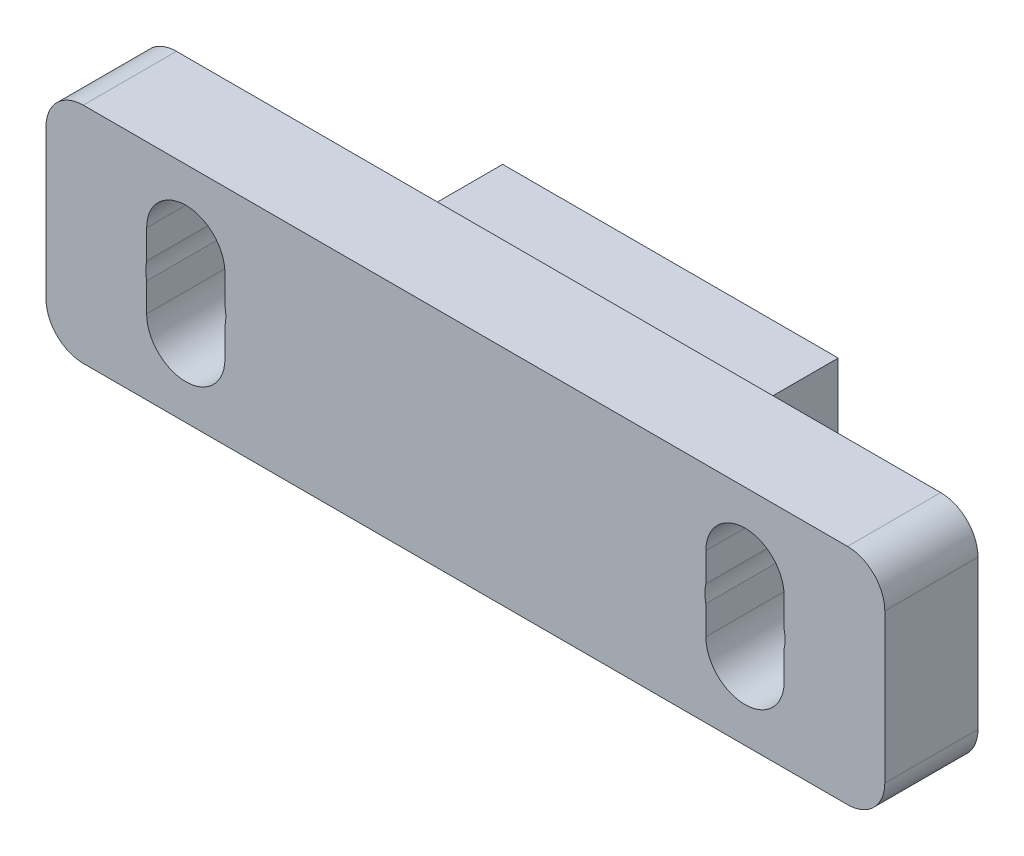
ISO-10303-21;
HEADER;
FILE_DESCRIPTION(('STEP AP214'),'2;1');
FILE_NAME('part.step','',(''),(''),'','','');
FILE_SCHEMA(('AUTOMOTIVE_DESIGN { 1 0 10303 214 1 1 1 1 }'));
ENDSEC;
DATA;
#1=APPLICATION_CONTEXT('core data for automotive mechanical design processes');
#2=APPLICATION_PROTOCOL_DEFINITION('international standard','automotive_design',2000,#1);
#3=PRODUCT_CONTEXT('',#1,'mechanical');
#4=PRODUCT('Part','Part','',(#3));
#5=PRODUCT_RELATED_PRODUCT_CATEGORY('part','',(#4));
#6=PRODUCT_DEFINITION_FORMATION('','',#4);
#7=PRODUCT_DEFINITION_CONTEXT('part definition',#1,'design');
#8=PRODUCT_DEFINITION('design','',#6,#7);
#9=PRODUCT_DEFINITION_SHAPE('','',#8);
#10=(LENGTH_UNIT() NAMED_UNIT(*) SI_UNIT(.MILLI.,.METRE.));
#11=(NAMED_UNIT(*) PLANE_ANGLE_UNIT() SI_UNIT($,.RADIAN.));
#12=(NAMED_UNIT(*) SI_UNIT($,.STERADIAN.) SOLID_ANGLE_UNIT());
#13=UNCERTAINTY_MEASURE_WITH_UNIT(LENGTH_MEASURE(1.E-05),#10,'distance_accuracy_value','');
#14=(GEOMETRIC_REPRESENTATION_CONTEXT(3) GLOBAL_UNCERTAINTY_ASSIGNED_CONTEXT((#13)) GLOBAL_UNIT_ASSIGNED_CONTEXT((#10,
#11,#12)) REPRESENTATION_CONTEXT('',''));
#15=CARTESIAN_POINT('',(0.,0.,0.));
#16=DIRECTION('',(0.,0.,1.));
#17=DIRECTION('',(1.,0.,0.));
#18=AXIS2_PLACEMENT_3D('',#15,#16,#17);
#19=CARTESIAN_POINT('',(15.,0.,5.));
#20=DIRECTION('',(0.,0.,-1.));
#21=DIRECTION('',(-1.,0.,0.));
#22=AXIS2_PLACEMENT_3D('',#19,#20,#21);
#23=CYLINDRICAL_SURFACE('',#22,2.15);
#24=DIRECTION('',(0.,0.,-1.));
#25=VECTOR('',#24,1.);
#26=CARTESIAN_POINT('',(12.9,0.460977222864625,5.));
#27=LINE('',#26,#25);
#28=CARTESIAN_POINT('',(12.9,0.460977222864625,5.));
#29=VERTEX_POINT('',#28);
#30=CARTESIAN_POINT('',(12.9,0.460977222864625,0.));
#31=VERTEX_POINT('',#30);
#32=EDGE_CURVE('E263',#29,#31,#27,.T.);
#33=ORIENTED_EDGE('',*,*,#32,.F.);
#34=CARTESIAN_POINT('',(15.,0.,5.));
#35=DIRECTION('',(0.,0.,1.));
#36=DIRECTION('',(1.,0.,0.));
#37=AXIS2_PLACEMENT_3D('',#34,#35,#36);
#38=CIRCLE('',#37,2.15);
#39=CARTESIAN_POINT('',(12.9,-0.460977222864632,5.));
#40=VERTEX_POINT('',#39);
#41=EDGE_CURVE('E380',#29,#40,#38,.T.);
#42=ORIENTED_EDGE('',*,*,#41,.T.);
#43=DIRECTION('',(0.,0.,-1.));
#44=VECTOR('',#43,1.);
#45=CARTESIAN_POINT('',(12.9,-0.460977222864632,5.));
#46=LINE('',#45,#44);
#47=CARTESIAN_POINT('',(12.9,-0.460977222864632,0.));
#48=VERTEX_POINT('',#47);
#49=EDGE_CURVE('E418',#48,#40,#46,.F.);
#50=ORIENTED_EDGE('',*,*,#49,.F.);
#51=CARTESIAN_POINT('',(15.,0.,0.));
#52=DIRECTION('',(0.,0.,1.));
#53=DIRECTION('',(1.,0.,0.));
#54=AXIS2_PLACEMENT_3D('',#51,#52,#53);
#55=CIRCLE('',#54,2.15);
#56=EDGE_CURVE('E381',#31,#48,#55,.T.);
#57=ORIENTED_EDGE('',*,*,#56,.F.);
#58=EDGE_LOOP('',(#33,#42,#50,#57));
#59=FACE_BOUND('',#58,.T.);
#60=ADVANCED_FACE('F32',(#59),#23,.F.);
#61=CARTESIAN_POINT('',(-15.,0.,5.));
#62=DIRECTION('',(0.,0.,-1.));
#63=DIRECTION('',(-1.,0.,0.));
#64=AXIS2_PLACEMENT_3D('',#61,#62,#63);
#65=CYLINDRICAL_SURFACE('',#64,2.15);
#66=DIRECTION('',(0.,0.,-1.));
#67=VECTOR('',#66,1.);
#68=CARTESIAN_POINT('',(-12.9,-0.46097722286464,5.));
#69=LINE('',#68,#67);
#70=CARTESIAN_POINT('',(-12.9,-0.460977222864644,5.));
#71=VERTEX_POINT('',#70);
#72=CARTESIAN_POINT('',(-12.9,-0.460977222864644,0.));
#73=VERTEX_POINT('',#72);
#74=EDGE_CURVE('E413',#71,#73,#69,.T.);
#75=ORIENTED_EDGE('',*,*,#74,.F.);
#76=CARTESIAN_POINT('',(-15.,0.,5.));
#77=DIRECTION('',(0.,0.,1.));
#78=DIRECTION('',(1.,0.,0.));
#79=AXIS2_PLACEMENT_3D('',#76,#77,#78);
#80=CIRCLE('',#79,2.15);
#81=CARTESIAN_POINT('',(-12.9,0.460977222864639,5.));
#82=VERTEX_POINT('',#81);
#83=EDGE_CURVE('E384',#71,#82,#80,.T.);
#84=ORIENTED_EDGE('',*,*,#83,.T.);
#85=DIRECTION('',(0.,0.,-1.));
#86=VECTOR('',#85,1.);
#87=CARTESIAN_POINT('',(-12.9,0.460977222864634,5.));
#88=LINE('',#87,#86);
#89=CARTESIAN_POINT('',(-12.9,0.460977222864639,0.));
#90=VERTEX_POINT('',#89);
#91=EDGE_CURVE('E409',#90,#82,#88,.F.);
#92=ORIENTED_EDGE('',*,*,#91,.F.);
#93=CARTESIAN_POINT('',(-15.,0.,0.));
#94=DIRECTION('',(0.,0.,1.));
#95=DIRECTION('',(1.,0.,0.));
#96=AXIS2_PLACEMENT_3D('',#93,#94,#95);
#97=CIRCLE('',#96,2.15);
#98=EDGE_CURVE('E389',#73,#90,#97,.T.);
#99=ORIENTED_EDGE('',*,*,#98,.F.);
#100=EDGE_LOOP('',(#75,#84,#92,#99));
#101=FACE_BOUND('',#100,.T.);
#102=ADVANCED_FACE('F468',(#101),#65,.F.);
#103=CARTESIAN_POINT('',(0.,0.,5.));
#104=DIRECTION('',(0.,0.,1.));
#105=DIRECTION('',(1.,0.,0.));
#106=AXIS2_PLACEMENT_3D('',#103,#104,#105);
#107=PLANE('',#106);
#108=DIRECTION('',(0.,-1.,0.));
#109=VECTOR('',#108,1.);
#110=CARTESIAN_POINT('',(12.9,-2.,5.));
#111=LINE('',#110,#109);
#112=CARTESIAN_POINT('',(12.9,-2.,5.));
#113=VERTEX_POINT('',#112);
#114=EDGE_CURVE('E329',#40,#113,#111,.T.);
#115=ORIENTED_EDGE('',*,*,#114,.F.);
#116=ORIENTED_EDGE('',*,*,#41,.F.);
#117=CARTESIAN_POINT('',(12.9,2.,5.));
#118=VERTEX_POINT('',#117);
#119=EDGE_CURVE('E312',#118,#29,#111,.T.);
#120=ORIENTED_EDGE('',*,*,#119,.F.);
#121=CARTESIAN_POINT('',(15.,2.,5.));
#122=DIRECTION('',(0.,0.,1.));
#123=DIRECTION('',(1.,0.,0.));
#124=AXIS2_PLACEMENT_3D('',#121,#122,#123);
#125=CIRCLE('',#124,2.1);
#126=CARTESIAN_POINT('',(17.1,2.,5.));
#127=VERTEX_POINT('',#126);
#128=EDGE_CURVE('E326',#127,#118,#125,.T.);
#129=ORIENTED_EDGE('',*,*,#128,.F.);
#130=DIRECTION('',(0.,1.,0.));
#131=VECTOR('',#130,1.);
#132=CARTESIAN_POINT('',(17.1,-2.,5.));
#133=LINE('',#132,#131);
#134=CARTESIAN_POINT('',(17.1,0.460977222864625,5.));
#135=VERTEX_POINT('',#134);
#136=EDGE_CURVE('E305',#135,#127,#133,.T.);
#137=ORIENTED_EDGE('',*,*,#136,.F.);
#138=CARTESIAN_POINT('',(17.1,-0.460977222864632,5.));
#139=VERTEX_POINT('',#138);
#140=EDGE_CURVE('E377',#139,#135,#38,.T.);
#141=ORIENTED_EDGE('',*,*,#140,.F.);
#142=CARTESIAN_POINT('',(17.1,-2.,5.));
#143=VERTEX_POINT('',#142);
#144=EDGE_CURVE('E324',#143,#139,#133,.T.);
#145=ORIENTED_EDGE('',*,*,#144,.F.);
#146=CARTESIAN_POINT('',(15.,-2.,5.));
#147=DIRECTION('',(0.,0.,1.));
#148=DIRECTION('',(1.,0.,0.));
#149=AXIS2_PLACEMENT_3D('',#146,#147,#148);
#150=CIRCLE('',#149,2.1);
#151=EDGE_CURVE('E303',#113,#143,#150,.T.);
#152=ORIENTED_EDGE('',*,*,#151,.F.);
#153=EDGE_LOOP('',(#115,#116,#120,#129,#137,#141,#145,#152));
#154=FACE_BOUND('',#153,.T.);
#155=DIRECTION('',(0.,1.,0.));
#156=VECTOR('',#155,1.);
#157=CARTESIAN_POINT('',(-12.9,2.,5.));
#158=LINE('',#157,#156);
#159=CARTESIAN_POINT('',(-12.9,2.,5.));
#160=VERTEX_POINT('',#159);
#161=EDGE_CURVE('E365',#82,#160,#158,.T.);
#162=ORIENTED_EDGE('',*,*,#161,.F.);
#163=ORIENTED_EDGE('',*,*,#83,.F.);
#164=CARTESIAN_POINT('',(-12.9,-2.,5.));
#165=VERTEX_POINT('',#164);
#166=EDGE_CURVE('E345',#165,#71,#158,.T.);
#167=ORIENTED_EDGE('',*,*,#166,.F.);
#168=CARTESIAN_POINT('',(-15.,-2.,5.));
#169=DIRECTION('',(0.,0.,1.));
#170=DIRECTION('',(1.,0.,0.));
#171=AXIS2_PLACEMENT_3D('',#168,#169,#170);
#172=CIRCLE('',#171,2.1);
#173=CARTESIAN_POINT('',(-17.1,-2.,5.));
#174=VERTEX_POINT('',#173);
#175=EDGE_CURVE('E362',#174,#165,#172,.T.);
#176=ORIENTED_EDGE('',*,*,#175,.F.);
#177=DIRECTION('',(0.,-1.,0.));
#178=VECTOR('',#177,1.);
#179=CARTESIAN_POINT('',(-17.1,2.,5.));
#180=LINE('',#179,#178);
#181=CARTESIAN_POINT('',(-17.1,-0.460977222864641,5.));
#182=VERTEX_POINT('',#181);
#183=EDGE_CURVE('E359',#182,#174,#180,.T.);
#184=ORIENTED_EDGE('',*,*,#183,.F.);
#185=CARTESIAN_POINT('',(-17.1,0.460977222864633,5.));
#186=VERTEX_POINT('',#185);
#187=EDGE_CURVE('E387',#186,#182,#80,.T.);
#188=ORIENTED_EDGE('',*,*,#187,.F.);
#189=CARTESIAN_POINT('',(-17.1,2.,5.));
#190=VERTEX_POINT('',#189);
#191=EDGE_CURVE('E360',#190,#186,#180,.T.);
#192=ORIENTED_EDGE('',*,*,#191,.F.);
#193=CARTESIAN_POINT('',(-15.,2.,5.));
#194=DIRECTION('',(0.,0.,1.));
#195=DIRECTION('',(1.,0.,0.));
#196=AXIS2_PLACEMENT_3D('',#193,#194,#195);
#197=CIRCLE('',#196,2.1);
#198=EDGE_CURVE('E334',#160,#190,#197,.T.);
#199=ORIENTED_EDGE('',*,*,#198,.F.);
#200=EDGE_LOOP('',(#162,#163,#167,#176,#184,#188,#192,#199));
#201=FACE_BOUND('',#200,.T.);
#202=DIRECTION('',(-1.,0.,0.));
#203=VECTOR('',#202,1.);
#204=CARTESIAN_POINT('',(-22.5,6.,5.));
#205=LINE('',#204,#203);
#206=CARTESIAN_POINT('',(20.5,6.,5.));
#207=VERTEX_POINT('',#206);
#208=CARTESIAN_POINT('',(-20.5,6.,5.));
#209=VERTEX_POINT('',#208);
#210=EDGE_CURVE('E399',#207,#209,#205,.T.);
#211=ORIENTED_EDGE('',*,*,#210,.T.);
#212=CARTESIAN_POINT('',(-20.5,4.,5.));
#213=DIRECTION('',(0.,0.,1.));
#214=DIRECTION('',(1.,0.,0.));
#215=AXIS2_PLACEMENT_3D('',#212,#213,#214);
#216=CIRCLE('',#215,2.);
#217=CARTESIAN_POINT('',(-22.5,4.,5.));
#218=VERTEX_POINT('',#217);
#219=EDGE_CURVE('E530',#209,#218,#216,.T.);
#220=ORIENTED_EDGE('',*,*,#219,.T.);
#221=DIRECTION('',(0.,-1.,0.));
#222=VECTOR('',#221,1.);
#223=CARTESIAN_POINT('',(-22.5,6.,5.));
#224=LINE('',#223,#222);
#225=CARTESIAN_POINT('',(-22.5,-4.,5.));
#226=VERTEX_POINT('',#225);
#227=EDGE_CURVE('E392',#218,#226,#224,.T.);
#228=ORIENTED_EDGE('',*,*,#227,.T.);
#229=CARTESIAN_POINT('',(-20.5,-4.,5.));
#230=DIRECTION('',(0.,0.,1.));
#231=DIRECTION('',(1.,0.,0.));
#232=AXIS2_PLACEMENT_3D('',#229,#230,#231);
#233=CIRCLE('',#232,2.);
#234=CARTESIAN_POINT('',(-20.5,-6.,5.));
#235=VERTEX_POINT('',#234);
#236=EDGE_CURVE('E527',#226,#235,#233,.T.);
#237=ORIENTED_EDGE('',*,*,#236,.T.);
#238=DIRECTION('',(1.,0.,0.));
#239=VECTOR('',#238,1.);
#240=CARTESIAN_POINT('',(-22.5,-6.,5.));
#241=LINE('',#240,#239);
#242=CARTESIAN_POINT('',(20.5,-6.,5.));
#243=VERTEX_POINT('',#242);
#244=EDGE_CURVE('E395',#235,#243,#241,.T.);
#245=ORIENTED_EDGE('',*,*,#244,.T.);
#246=CARTESIAN_POINT('',(20.5,-4.,5.));
#247=DIRECTION('',(0.,0.,1.));
#248=DIRECTION('',(1.,0.,0.));
#249=AXIS2_PLACEMENT_3D('',#246,#247,#248);
#250=CIRCLE('',#249,2.);
#251=CARTESIAN_POINT('',(22.5,-4.,5.));
#252=VERTEX_POINT('',#251);
#253=EDGE_CURVE('E53',#243,#252,#250,.T.);
#254=ORIENTED_EDGE('',*,*,#253,.T.);
#255=DIRECTION('',(0.,1.,0.));
#256=VECTOR('',#255,1.);
#257=CARTESIAN_POINT('',(22.5,6.,5.));
#258=LINE('',#257,#256);
#259=CARTESIAN_POINT('',(22.5,4.,5.));
#260=VERTEX_POINT('',#259);
#261=EDGE_CURVE('E398',#252,#260,#258,.T.);
#262=ORIENTED_EDGE('',*,*,#261,.T.);
#263=CARTESIAN_POINT('',(20.5,4.,5.));
#264=DIRECTION('',(0.,0.,1.));
#265=DIRECTION('',(1.,0.,0.));
#266=AXIS2_PLACEMENT_3D('',#263,#264,#265);
#267=CIRCLE('',#266,2.);
#268=EDGE_CURVE('E528',#260,#207,#267,.T.);
#269=ORIENTED_EDGE('',*,*,#268,.T.);
#270=EDGE_LOOP('',(#211,#220,#228,#237,#245,#254,#262,#269));
#271=FACE_BOUND('',#270,.T.);
#272=ADVANCED_FACE('F436',(#154,#201,#271),#107,.T.);
#273=CARTESIAN_POINT('',(0.,0.,0.));
#274=DIRECTION('',(0.,0.,1.));
#275=DIRECTION('',(1.,0.,0.));
#276=AXIS2_PLACEMENT_3D('',#273,#274,#275);
#277=PLANE('',#276);
#278=ORIENTED_EDGE('',*,*,#98,.T.);
#279=DIRECTION('',(0.,1.,0.));
#280=VECTOR('',#279,1.);
#281=CARTESIAN_POINT('',(-12.9,2.,0.));
#282=LINE('',#281,#280);
#283=CARTESIAN_POINT('',(-12.9,2.,0.));
#284=VERTEX_POINT('',#283);
#285=EDGE_CURVE('E352',#90,#284,#282,.T.);
#286=ORIENTED_EDGE('',*,*,#285,.T.);
#287=CARTESIAN_POINT('',(-15.,2.,0.));
#288=DIRECTION('',(0.,0.,1.));
#289=DIRECTION('',(1.,0.,0.));
#290=AXIS2_PLACEMENT_3D('',#287,#288,#289);
#291=CIRCLE('',#290,2.1);
#292=CARTESIAN_POINT('',(-17.1,2.,0.));
#293=VERTEX_POINT('',#292);
#294=EDGE_CURVE('E341',#284,#293,#291,.T.);
#295=ORIENTED_EDGE('',*,*,#294,.T.);
#296=DIRECTION('',(0.,-1.,0.));
#297=VECTOR('',#296,1.);
#298=CARTESIAN_POINT('',(-17.1,2.,0.));
#299=LINE('',#298,#297);
#300=CARTESIAN_POINT('',(-17.1,0.460977222864633,0.));
#301=VERTEX_POINT('',#300);
#302=EDGE_CURVE('E346',#293,#301,#299,.T.);
#303=ORIENTED_EDGE('',*,*,#302,.T.);
#304=CARTESIAN_POINT('',(-17.1,-0.460977222864641,0.));
#305=VERTEX_POINT('',#304);
#306=EDGE_CURVE('E388',#301,#305,#97,.T.);
#307=ORIENTED_EDGE('',*,*,#306,.T.);
#308=CARTESIAN_POINT('',(-17.1,-2.,0.));
#309=VERTEX_POINT('',#308);
#310=EDGE_CURVE('E344',#305,#309,#299,.T.);
#311=ORIENTED_EDGE('',*,*,#310,.T.);
#312=CARTESIAN_POINT('',(-15.,-2.,0.));
#313=DIRECTION('',(0.,0.,1.));
#314=DIRECTION('',(1.,0.,0.));
#315=AXIS2_PLACEMENT_3D('',#312,#313,#314);
#316=CIRCLE('',#315,2.1);
#317=CARTESIAN_POINT('',(-12.9,-2.,0.));
#318=VERTEX_POINT('',#317);
#319=EDGE_CURVE('E349',#309,#318,#316,.T.);
#320=ORIENTED_EDGE('',*,*,#319,.T.);
#321=EDGE_CURVE('E353',#318,#73,#282,.T.);
#322=ORIENTED_EDGE('',*,*,#321,.T.);
#323=EDGE_LOOP('',(#278,#286,#295,#303,#307,#311,#320,#322));
#324=FACE_BOUND('',#323,.T.);
#325=DIRECTION('',(0.,-1.,0.));
#326=VECTOR('',#325,1.);
#327=CARTESIAN_POINT('',(-22.5,6.,0.));
#328=LINE('',#327,#326);
#329=CARTESIAN_POINT('',(-22.5,4.,0.));
#330=VERTEX_POINT('',#329);
#331=CARTESIAN_POINT('',(-22.5,-4.,0.));
#332=VERTEX_POINT('',#331);
#333=EDGE_CURVE('E275',#330,#332,#328,.T.);
#334=ORIENTED_EDGE('',*,*,#333,.F.);
#335=CARTESIAN_POINT('',(-20.5,4.,0.));
#336=DIRECTION('',(0.,0.,1.));
#337=DIRECTION('',(1.,0.,0.));
#338=AXIS2_PLACEMENT_3D('',#335,#336,#337);
#339=CIRCLE('',#338,2.);
#340=CARTESIAN_POINT('',(-20.5,6.,0.));
#341=VERTEX_POINT('',#340);
#342=EDGE_CURVE('E544',#330,#341,#339,.F.);
#343=ORIENTED_EDGE('',*,*,#342,.T.);
#344=DIRECTION('',(-1.,0.,0.));
#345=VECTOR('',#344,1.);
#346=CARTESIAN_POINT('',(-22.5,6.,0.));
#347=LINE('',#346,#345);
#348=CARTESIAN_POINT('',(20.5,6.,0.));
#349=VERTEX_POINT('',#348);
#350=EDGE_CURVE('E396',#349,#341,#347,.T.);
#351=ORIENTED_EDGE('',*,*,#350,.F.);
#352=CARTESIAN_POINT('',(20.5,4.,0.));
#353=DIRECTION('',(0.,0.,1.));
#354=DIRECTION('',(1.,0.,0.));
#355=AXIS2_PLACEMENT_3D('',#352,#353,#354);
#356=CIRCLE('',#355,2.);
#357=CARTESIAN_POINT('',(22.5,4.,0.));
#358=VERTEX_POINT('',#357);
#359=EDGE_CURVE('E266',#349,#358,#356,.F.);
#360=ORIENTED_EDGE('',*,*,#359,.T.);
#361=DIRECTION('',(0.,1.,0.));
#362=VECTOR('',#361,1.);
#363=CARTESIAN_POINT('',(22.5,6.,0.));
#364=LINE('',#363,#362);
#365=CARTESIAN_POINT('',(22.5,-4.,0.));
#366=VERTEX_POINT('',#365);
#367=EDGE_CURVE('E269',#366,#358,#364,.T.);
#368=ORIENTED_EDGE('',*,*,#367,.F.);
#369=CARTESIAN_POINT('',(20.5,-4.,0.));
#370=DIRECTION('',(0.,0.,1.));
#371=DIRECTION('',(1.,0.,0.));
#372=AXIS2_PLACEMENT_3D('',#369,#370,#371);
#373=CIRCLE('',#372,2.);
#374=CARTESIAN_POINT('',(20.5,-6.,0.));
#375=VERTEX_POINT('',#374);
#376=EDGE_CURVE('E545',#366,#375,#373,.F.);
#377=ORIENTED_EDGE('',*,*,#376,.T.);
#378=DIRECTION('',(1.,0.,0.));
#379=VECTOR('',#378,1.);
#380=CARTESIAN_POINT('',(-22.5,-6.,0.));
#381=LINE('',#380,#379);
#382=CARTESIAN_POINT('',(9.,-6.,0.));
#383=VERTEX_POINT('',#382);
#384=EDGE_CURVE('E270',#383,#375,#381,.T.);
#385=ORIENTED_EDGE('',*,*,#384,.F.);
#386=DIRECTION('',(0.,1.,0.));
#387=VECTOR('',#386,1.);
#388=CARTESIAN_POINT('',(9.,-6.,0.));
#389=LINE('',#388,#387);
#390=CARTESIAN_POINT('',(9.,3.5,0.));
#391=VERTEX_POINT('',#390);
#392=EDGE_CURVE('E248',#383,#391,#389,.T.);
#393=ORIENTED_EDGE('',*,*,#392,.T.);
#394=DIRECTION('',(-1.,0.,0.));
#395=VECTOR('',#394,1.);
#396=CARTESIAN_POINT('',(-9.,3.5,0.));
#397=LINE('',#396,#395);
#398=CARTESIAN_POINT('',(-9.,3.5,0.));
#399=VERTEX_POINT('',#398);
#400=EDGE_CURVE('E245',#391,#399,#397,.T.);
#401=ORIENTED_EDGE('',*,*,#400,.T.);
#402=DIRECTION('',(0.,-1.,0.));
#403=VECTOR('',#402,1.);
#404=CARTESIAN_POINT('',(-9.,-6.,0.));
#405=LINE('',#404,#403);
#406=CARTESIAN_POINT('',(-9.,-6.,0.));
#407=VERTEX_POINT('',#406);
#408=EDGE_CURVE('E256',#399,#407,#405,.T.);
#409=ORIENTED_EDGE('',*,*,#408,.T.);
#410=CARTESIAN_POINT('',(-20.5,-6.,0.));
#411=VERTEX_POINT('',#410);
#412=EDGE_CURVE('E225',#411,#407,#381,.T.);
#413=ORIENTED_EDGE('',*,*,#412,.F.);
#414=CARTESIAN_POINT('',(-20.5,-4.,0.));
#415=DIRECTION('',(0.,0.,1.));
#416=DIRECTION('',(1.,0.,0.));
#417=AXIS2_PLACEMENT_3D('',#414,#415,#416);
#418=CIRCLE('',#417,2.);
#419=EDGE_CURVE('E541',#411,#332,#418,.F.);
#420=ORIENTED_EDGE('',*,*,#419,.T.);
#421=EDGE_LOOP('',(#334,#343,#351,#360,#368,#377,#385,#393,#401,#409,#413,#420));
#422=FACE_BOUND('',#421,.T.);
#423=ORIENTED_EDGE('',*,*,#56,.T.);
#424=DIRECTION('',(0.,-1.,0.));
#425=VECTOR('',#424,1.);
#426=CARTESIAN_POINT('',(12.9,-2.,0.));
#427=LINE('',#426,#425);
#428=CARTESIAN_POINT('',(12.9,-2.,0.));
#429=VERTEX_POINT('',#428);
#430=EDGE_CURVE('E319',#48,#429,#427,.T.);
#431=ORIENTED_EDGE('',*,*,#430,.T.);
#432=CARTESIAN_POINT('',(15.,-2.,0.));
#433=DIRECTION('',(0.,0.,1.));
#434=DIRECTION('',(1.,0.,0.));
#435=AXIS2_PLACEMENT_3D('',#432,#433,#434);
#436=CIRCLE('',#435,2.1);
#437=CARTESIAN_POINT('',(17.1,-2.,0.));
#438=VERTEX_POINT('',#437);
#439=EDGE_CURVE('E308',#429,#438,#436,.T.);
#440=ORIENTED_EDGE('',*,*,#439,.T.);
#441=DIRECTION('',(0.,1.,0.));
#442=VECTOR('',#441,1.);
#443=CARTESIAN_POINT('',(17.1,-2.,0.));
#444=LINE('',#443,#442);
#445=CARTESIAN_POINT('',(17.1,-0.460977222864632,0.));
#446=VERTEX_POINT('',#445);
#447=EDGE_CURVE('E313',#438,#446,#444,.T.);
#448=ORIENTED_EDGE('',*,*,#447,.T.);
#449=CARTESIAN_POINT('',(17.1,0.460977222864625,0.));
#450=VERTEX_POINT('',#449);
#451=EDGE_CURVE('E370',#446,#450,#55,.T.);
#452=ORIENTED_EDGE('',*,*,#451,.T.);
#453=CARTESIAN_POINT('',(17.1,2.,0.));
#454=VERTEX_POINT('',#453);
#455=EDGE_CURVE('E311',#450,#454,#444,.T.);
#456=ORIENTED_EDGE('',*,*,#455,.T.);
#457=CARTESIAN_POINT('',(15.,2.,0.));
#458=DIRECTION('',(0.,0.,1.));
#459=DIRECTION('',(1.,0.,0.));
#460=AXIS2_PLACEMENT_3D('',#457,#458,#459);
#461=CIRCLE('',#460,2.1);
#462=CARTESIAN_POINT('',(12.9,2.,0.));
#463=VERTEX_POINT('',#462);
#464=EDGE_CURVE('E316',#454,#463,#461,.T.);
#465=ORIENTED_EDGE('',*,*,#464,.T.);
#466=EDGE_CURVE('E320',#463,#31,#427,.T.);
#467=ORIENTED_EDGE('',*,*,#466,.T.);
#468=EDGE_LOOP('',(#423,#431,#440,#448,#452,#456,#465,#467));
#469=FACE_BOUND('',#468,.T.);
#470=ADVANCED_FACE('F295',(#324,#422,#469),#277,.F.);
#471=CARTESIAN_POINT('',(-22.5,6.,5.));
#472=DIRECTION('',(1.,0.,0.));
#473=DIRECTION('',(0.,1.,0.));
#474=AXIS2_PLACEMENT_3D('',#471,#472,#473);
#475=PLANE('',#474);
#476=ORIENTED_EDGE('',*,*,#227,.F.);
#477=DIRECTION('',(0.,0.,-1.));
#478=VECTOR('',#477,1.);
#479=CARTESIAN_POINT('',(-22.5,4.,5.));
#480=LINE('',#479,#478);
#481=EDGE_CURVE('E262',#218,#330,#480,.T.);
#482=ORIENTED_EDGE('',*,*,#481,.T.);
#483=ORIENTED_EDGE('',*,*,#333,.T.);
#484=DIRECTION('',(0.,0.,-1.));
#485=VECTOR('',#484,1.);
#486=CARTESIAN_POINT('',(-22.5,-4.,5.));
#487=LINE('',#486,#485);
#488=EDGE_CURVE('E260',#332,#226,#487,.F.);
#489=ORIENTED_EDGE('',*,*,#488,.T.);
#490=EDGE_LOOP('',(#476,#482,#483,#489));
#491=FACE_BOUND('',#490,.T.);
#492=ADVANCED_FACE('F500',(#491),#475,.F.);
#493=CARTESIAN_POINT('',(-22.5,-6.,5.));
#494=DIRECTION('',(0.,1.,0.));
#495=DIRECTION('',(0.,0.,1.));
#496=AXIS2_PLACEMENT_3D('',#493,#494,#495);
#497=PLANE('',#496);
#498=ORIENTED_EDGE('',*,*,#244,.F.);
#499=DIRECTION('',(0.,0.,-1.));
#500=VECTOR('',#499,1.);
#501=CARTESIAN_POINT('',(-20.5,-6.,5.));
#502=LINE('',#501,#500);
#503=EDGE_CURVE('E538',#235,#411,#502,.T.);
#504=ORIENTED_EDGE('',*,*,#503,.T.);
#505=ORIENTED_EDGE('',*,*,#412,.T.);
#506=DIRECTION('',(0.,0.,1.));
#507=VECTOR('',#506,1.);
#508=CARTESIAN_POINT('',(-9.,-6.,-6.));
#509=LINE('',#508,#507);
#510=CARTESIAN_POINT('',(-9.,-6.,-6.));
#511=VERTEX_POINT('',#510);
#512=EDGE_CURVE('E218',#511,#407,#509,.T.);
#513=ORIENTED_EDGE('',*,*,#512,.F.);
#514=DIRECTION('',(1.,0.,0.));
#515=VECTOR('',#514,1.);
#516=CARTESIAN_POINT('',(-9.,-6.,-6.));
#517=LINE('',#516,#515);
#518=CARTESIAN_POINT('',(9.,-6.,-6.));
#519=VERTEX_POINT('',#518);
#520=EDGE_CURVE('E222',#511,#519,#517,.T.);
#521=ORIENTED_EDGE('',*,*,#520,.T.);
#522=DIRECTION('',(0.,0.,1.));
#523=VECTOR('',#522,1.);
#524=CARTESIAN_POINT('',(9.,-6.,-6.));
#525=LINE('',#524,#523);
#526=EDGE_CURVE('E229',#519,#383,#525,.T.);
#527=ORIENTED_EDGE('',*,*,#526,.T.);
#528=ORIENTED_EDGE('',*,*,#384,.T.);
#529=DIRECTION('',(0.,0.,-1.));
#530=VECTOR('',#529,1.);
#531=CARTESIAN_POINT('',(20.5,-6.,5.));
#532=LINE('',#531,#530);
#533=EDGE_CURVE('E526',#375,#243,#532,.F.);
#534=ORIENTED_EDGE('',*,*,#533,.T.);
#535=EDGE_LOOP('',(#498,#504,#505,#513,#521,#527,#528,#534));
#536=FACE_BOUND('',#535,.T.);
#537=ADVANCED_FACE('F221',(#536),#497,.F.);
#538=CARTESIAN_POINT('',(22.5,6.,5.));
#539=DIRECTION('',(-1.,0.,0.));
#540=DIRECTION('',(0.,-1.,0.));
#541=AXIS2_PLACEMENT_3D('',#538,#539,#540);
#542=PLANE('',#541);
#543=ORIENTED_EDGE('',*,*,#261,.F.);
#544=DIRECTION('',(0.,0.,-1.));
#545=VECTOR('',#544,1.);
#546=CARTESIAN_POINT('',(22.5,-4.,5.));
#547=LINE('',#546,#545);
#548=EDGE_CURVE('E11',#252,#366,#547,.T.);
#549=ORIENTED_EDGE('',*,*,#548,.T.);
#550=ORIENTED_EDGE('',*,*,#367,.T.);
#551=DIRECTION('',(0.,0.,-1.));
#552=VECTOR('',#551,1.);
#553=CARTESIAN_POINT('',(22.5,4.,5.));
#554=LINE('',#553,#552);
#555=EDGE_CURVE('E40',#358,#260,#554,.F.);
#556=ORIENTED_EDGE('',*,*,#555,.T.);
#557=EDGE_LOOP('',(#543,#549,#550,#556));
#558=FACE_BOUND('',#557,.T.);
#559=ADVANCED_FACE('F492',(#558),#542,.F.);
#560=CARTESIAN_POINT('',(-22.5,6.,5.));
#561=DIRECTION('',(0.,-1.,0.));
#562=DIRECTION('',(1.,0.,0.));
#563=AXIS2_PLACEMENT_3D('',#560,#561,#562);
#564=PLANE('',#563);
#565=ORIENTED_EDGE('',*,*,#350,.T.);
#566=DIRECTION('',(0.,0.,-1.));
#567=VECTOR('',#566,1.);
#568=CARTESIAN_POINT('',(-20.5,6.,5.));
#569=LINE('',#568,#567);
#570=EDGE_CURVE('E532',#341,#209,#569,.F.);
#571=ORIENTED_EDGE('',*,*,#570,.T.);
#572=ORIENTED_EDGE('',*,*,#210,.F.);
#573=DIRECTION('',(0.,0.,-1.));
#574=VECTOR('',#573,1.);
#575=CARTESIAN_POINT('',(20.5,6.,5.));
#576=LINE('',#575,#574);
#577=EDGE_CURVE('E552',#207,#349,#576,.T.);
#578=ORIENTED_EDGE('',*,*,#577,.T.);
#579=EDGE_LOOP('',(#565,#571,#572,#578));
#580=FACE_BOUND('',#579,.T.);
#581=ADVANCED_FACE('F487',(#580),#564,.F.);
#582=DIRECTION('',(0.,0.,-1.));
#583=VECTOR('',#582,1.);
#584=CARTESIAN_POINT('',(-17.1,0.460977222864633,5.));
#585=LINE('',#584,#583);
#586=EDGE_CURVE('E404',#186,#301,#585,.T.);
#587=ORIENTED_EDGE('',*,*,#586,.F.);
#588=ORIENTED_EDGE('',*,*,#187,.T.);
#589=DIRECTION('',(0.,0.,-1.));
#590=VECTOR('',#589,1.);
#591=CARTESIAN_POINT('',(-17.1,-0.460977222864641,5.));
#592=LINE('',#591,#590);
#593=EDGE_CURVE('E401',#305,#182,#592,.F.);
#594=ORIENTED_EDGE('',*,*,#593,.F.);
#595=ORIENTED_EDGE('',*,*,#306,.F.);
#596=EDGE_LOOP('',(#587,#588,#594,#595));
#597=FACE_BOUND('',#596,.T.);
#598=ADVANCED_FACE('F475',(#597),#65,.F.);
#599=DIRECTION('',(0.,0.,-1.));
#600=VECTOR('',#599,1.);
#601=CARTESIAN_POINT('',(17.1,-0.460977222864632,5.));
#602=LINE('',#601,#600);
#603=EDGE_CURVE('E417',#139,#446,#602,.T.);
#604=ORIENTED_EDGE('',*,*,#603,.F.);
#605=ORIENTED_EDGE('',*,*,#140,.T.);
#606=DIRECTION('',(0.,0.,-1.));
#607=VECTOR('',#606,1.);
#608=CARTESIAN_POINT('',(17.1,0.460977222864625,5.));
#609=LINE('',#608,#607);
#610=EDGE_CURVE('E415',#450,#135,#609,.F.);
#611=ORIENTED_EDGE('',*,*,#610,.F.);
#612=ORIENTED_EDGE('',*,*,#451,.F.);
#613=EDGE_LOOP('',(#604,#605,#611,#612));
#614=FACE_BOUND('',#613,.T.);
#615=ADVANCED_FACE('F451',(#614),#23,.F.);
#616=CARTESIAN_POINT('',(-12.9,2.,0.));
#617=DIRECTION('',(1.,0.,0.));
#618=DIRECTION('',(0.,1.,0.));
#619=AXIS2_PLACEMENT_3D('',#616,#617,#618);
#620=PLANE('',#619);
#621=ORIENTED_EDGE('',*,*,#74,.T.);
#622=ORIENTED_EDGE('',*,*,#321,.F.);
#623=DIRECTION('',(0.,0.,1.));
#624=VECTOR('',#623,1.);
#625=CARTESIAN_POINT('',(-12.9,-2.,0.));
#626=LINE('',#625,#624);
#627=EDGE_CURVE('E371',#318,#165,#626,.T.);
#628=ORIENTED_EDGE('',*,*,#627,.T.);
#629=ORIENTED_EDGE('',*,*,#166,.T.);
#630=EDGE_LOOP('',(#621,#622,#628,#629));
#631=FACE_BOUND('',#630,.T.);
#632=ADVANCED_FACE('F478',(#631),#620,.F.);
#633=CARTESIAN_POINT('',(-17.1,2.,0.));
#634=DIRECTION('',(-1.,0.,0.));
#635=DIRECTION('',(0.,0.,1.));
#636=AXIS2_PLACEMENT_3D('',#633,#634,#635);
#637=PLANE('',#636);
#638=ORIENTED_EDGE('',*,*,#593,.T.);
#639=ORIENTED_EDGE('',*,*,#183,.T.);
#640=DIRECTION('',(0.,0.,1.));
#641=VECTOR('',#640,1.);
#642=CARTESIAN_POINT('',(-17.1,-2.,0.));
#643=LINE('',#642,#641);
#644=EDGE_CURVE('E373',#309,#174,#643,.T.);
#645=ORIENTED_EDGE('',*,*,#644,.F.);
#646=ORIENTED_EDGE('',*,*,#310,.F.);
#647=EDGE_LOOP('',(#638,#639,#645,#646));
#648=FACE_BOUND('',#647,.T.);
#649=ADVANCED_FACE('F483',(#648),#637,.F.);
#650=CARTESIAN_POINT('',(-15.,-2.,0.));
#651=DIRECTION('',(0.,0.,1.));
#652=DIRECTION('',(1.,0.,0.));
#653=AXIS2_PLACEMENT_3D('',#650,#651,#652);
#654=CYLINDRICAL_SURFACE('',#653,2.1);
#655=ORIENTED_EDGE('',*,*,#175,.T.);
#656=ORIENTED_EDGE('',*,*,#627,.F.);
#657=ORIENTED_EDGE('',*,*,#319,.F.);
#658=ORIENTED_EDGE('',*,*,#644,.T.);
#659=EDGE_LOOP('',(#655,#656,#657,#658));
#660=FACE_BOUND('',#659,.T.);
#661=ADVANCED_FACE('F570',(#660),#654,.F.);
#662=ORIENTED_EDGE('',*,*,#586,.T.);
#663=ORIENTED_EDGE('',*,*,#302,.F.);
#664=DIRECTION('',(0.,0.,1.));
#665=VECTOR('',#664,1.);
#666=CARTESIAN_POINT('',(-17.1,2.,0.));
#667=LINE('',#666,#665);
#668=EDGE_CURVE('E356',#293,#190,#667,.T.);
#669=ORIENTED_EDGE('',*,*,#668,.T.);
#670=ORIENTED_EDGE('',*,*,#191,.T.);
#671=EDGE_LOOP('',(#662,#663,#669,#670));
#672=FACE_BOUND('',#671,.T.);
#673=ADVANCED_FACE('F577',(#672),#637,.F.);
#674=CARTESIAN_POINT('',(-15.,2.,0.));
#675=DIRECTION('',(0.,0.,1.));
#676=DIRECTION('',(1.,0.,0.));
#677=AXIS2_PLACEMENT_3D('',#674,#675,#676);
#678=CYLINDRICAL_SURFACE('',#677,2.1);
#679=ORIENTED_EDGE('',*,*,#198,.T.);
#680=ORIENTED_EDGE('',*,*,#668,.F.);
#681=ORIENTED_EDGE('',*,*,#294,.F.);
#682=DIRECTION('',(0.,0.,1.));
#683=VECTOR('',#682,1.);
#684=CARTESIAN_POINT('',(-12.9,2.,0.));
#685=LINE('',#684,#683);
#686=EDGE_CURVE('E367',#284,#160,#685,.T.);
#687=ORIENTED_EDGE('',*,*,#686,.T.);
#688=EDGE_LOOP('',(#679,#680,#681,#687));
#689=FACE_BOUND('',#688,.T.);
#690=ADVANCED_FACE('F579',(#689),#678,.F.);
#691=ORIENTED_EDGE('',*,*,#91,.T.);
#692=ORIENTED_EDGE('',*,*,#161,.T.);
#693=ORIENTED_EDGE('',*,*,#686,.F.);
#694=ORIENTED_EDGE('',*,*,#285,.F.);
#695=EDGE_LOOP('',(#691,#692,#693,#694));
#696=FACE_BOUND('',#695,.T.);
#697=ADVANCED_FACE('F486',(#696),#620,.F.);
#698=CARTESIAN_POINT('',(12.9,-2.,0.));
#699=DIRECTION('',(-1.,0.,0.));
#700=DIRECTION('',(0.,0.,1.));
#701=AXIS2_PLACEMENT_3D('',#698,#699,#700);
#702=PLANE('',#701);
#703=ORIENTED_EDGE('',*,*,#32,.T.);
#704=ORIENTED_EDGE('',*,*,#466,.F.);
#705=DIRECTION('',(0.,0.,1.));
#706=VECTOR('',#705,1.);
#707=CARTESIAN_POINT('',(12.9,2.,0.));
#708=LINE('',#707,#706);
#709=EDGE_CURVE('E335',#463,#118,#708,.T.);
#710=ORIENTED_EDGE('',*,*,#709,.T.);
#711=ORIENTED_EDGE('',*,*,#119,.T.);
#712=EDGE_LOOP('',(#703,#704,#710,#711));
#713=FACE_BOUND('',#712,.T.);
#714=ADVANCED_FACE('F425',(#713),#702,.F.);
#715=CARTESIAN_POINT('',(17.1,-2.,0.));
#716=DIRECTION('',(1.,0.,0.));
#717=DIRECTION('',(0.,0.,-1.));
#718=AXIS2_PLACEMENT_3D('',#715,#716,#717);
#719=PLANE('',#718);
#720=ORIENTED_EDGE('',*,*,#610,.T.);
#721=ORIENTED_EDGE('',*,*,#136,.T.);
#722=DIRECTION('',(0.,0.,1.));
#723=VECTOR('',#722,1.);
#724=CARTESIAN_POINT('',(17.1,2.,0.));
#725=LINE('',#724,#723);
#726=EDGE_CURVE('E337',#454,#127,#725,.T.);
#727=ORIENTED_EDGE('',*,*,#726,.F.);
#728=ORIENTED_EDGE('',*,*,#455,.F.);
#729=EDGE_LOOP('',(#720,#721,#727,#728));
#730=FACE_BOUND('',#729,.T.);
#731=ADVANCED_FACE('F455',(#730),#719,.F.);
#732=CARTESIAN_POINT('',(15.,2.,0.));
#733=DIRECTION('',(0.,0.,1.));
#734=DIRECTION('',(1.,0.,0.));
#735=AXIS2_PLACEMENT_3D('',#732,#733,#734);
#736=CYLINDRICAL_SURFACE('',#735,2.1);
#737=ORIENTED_EDGE('',*,*,#128,.T.);
#738=ORIENTED_EDGE('',*,*,#709,.F.);
#739=ORIENTED_EDGE('',*,*,#464,.F.);
#740=ORIENTED_EDGE('',*,*,#726,.T.);
#741=EDGE_LOOP('',(#737,#738,#739,#740));
#742=FACE_BOUND('',#741,.T.);
#743=ADVANCED_FACE('F457',(#742),#736,.F.);
#744=ORIENTED_EDGE('',*,*,#603,.T.);
#745=ORIENTED_EDGE('',*,*,#447,.F.);
#746=DIRECTION('',(0.,0.,1.));
#747=VECTOR('',#746,1.);
#748=CARTESIAN_POINT('',(17.1,-2.,0.));
#749=LINE('',#748,#747);
#750=EDGE_CURVE('E322',#438,#143,#749,.T.);
#751=ORIENTED_EDGE('',*,*,#750,.T.);
#752=ORIENTED_EDGE('',*,*,#144,.T.);
#753=EDGE_LOOP('',(#744,#745,#751,#752));
#754=FACE_BOUND('',#753,.T.);
#755=ADVANCED_FACE('F459',(#754),#719,.F.);
#756=CARTESIAN_POINT('',(15.,-2.,0.));
#757=DIRECTION('',(0.,0.,1.));
#758=DIRECTION('',(1.,0.,0.));
#759=AXIS2_PLACEMENT_3D('',#756,#757,#758);
#760=CYLINDRICAL_SURFACE('',#759,2.1);
#761=ORIENTED_EDGE('',*,*,#151,.T.);
#762=ORIENTED_EDGE('',*,*,#750,.F.);
#763=ORIENTED_EDGE('',*,*,#439,.F.);
#764=DIRECTION('',(0.,0.,1.));
#765=VECTOR('',#764,1.);
#766=CARTESIAN_POINT('',(12.9,-2.,0.));
#767=LINE('',#766,#765);
#768=EDGE_CURVE('E331',#429,#113,#767,.T.);
#769=ORIENTED_EDGE('',*,*,#768,.T.);
#770=EDGE_LOOP('',(#761,#762,#763,#769));
#771=FACE_BOUND('',#770,.T.);
#772=ADVANCED_FACE('F444',(#771),#760,.F.);
#773=ORIENTED_EDGE('',*,*,#49,.T.);
#774=ORIENTED_EDGE('',*,*,#114,.T.);
#775=ORIENTED_EDGE('',*,*,#768,.F.);
#776=ORIENTED_EDGE('',*,*,#430,.F.);
#777=EDGE_LOOP('',(#773,#774,#775,#776));
#778=FACE_BOUND('',#777,.T.);
#779=ADVANCED_FACE('F441',(#778),#702,.F.);
#780=CARTESIAN_POINT('',(-9.,-6.,-6.));
#781=DIRECTION('',(-1.,0.,0.));
#782=DIRECTION('',(0.,0.,1.));
#783=AXIS2_PLACEMENT_3D('',#780,#781,#782);
#784=PLANE('',#783);
#785=ORIENTED_EDGE('',*,*,#408,.F.);
#786=DIRECTION('',(0.,0.,1.));
#787=VECTOR('',#786,1.);
#788=CARTESIAN_POINT('',(-9.,3.5,-6.));
#789=LINE('',#788,#787);
#790=CARTESIAN_POINT('',(-9.,3.5,-6.));
#791=VERTEX_POINT('',#790);
#792=EDGE_CURVE('E244',#791,#399,#789,.T.);
#793=ORIENTED_EDGE('',*,*,#792,.F.);
#794=DIRECTION('',(0.,-1.,0.));
#795=VECTOR('',#794,1.);
#796=CARTESIAN_POINT('',(-9.,-6.,-6.));
#797=LINE('',#796,#795);
#798=EDGE_CURVE('E237',#791,#511,#797,.T.);
#799=ORIENTED_EDGE('',*,*,#798,.T.);
#800=ORIENTED_EDGE('',*,*,#512,.T.);
#801=EDGE_LOOP('',(#785,#793,#799,#800));
#802=FACE_BOUND('',#801,.T.);
#803=ADVANCED_FACE('F242',(#802),#784,.T.);
#804=CARTESIAN_POINT('',(-9.,3.5,-6.));
#805=DIRECTION('',(0.,1.,0.));
#806=DIRECTION('',(-1.,0.,0.));
#807=AXIS2_PLACEMENT_3D('',#804,#805,#806);
#808=PLANE('',#807);
#809=ORIENTED_EDGE('',*,*,#400,.F.);
#810=DIRECTION('',(0.,0.,1.));
#811=VECTOR('',#810,1.);
#812=CARTESIAN_POINT('',(9.,3.5,-6.));
#813=LINE('',#812,#811);
#814=CARTESIAN_POINT('',(9.,3.5,-6.));
#815=VERTEX_POINT('',#814);
#816=EDGE_CURVE('E285',#815,#391,#813,.T.);
#817=ORIENTED_EDGE('',*,*,#816,.F.);
#818=DIRECTION('',(-1.,0.,0.));
#819=VECTOR('',#818,1.);
#820=CARTESIAN_POINT('',(-9.,3.5,-6.));
#821=LINE('',#820,#819);
#822=EDGE_CURVE('E230',#815,#791,#821,.T.);
#823=ORIENTED_EDGE('',*,*,#822,.T.);
#824=ORIENTED_EDGE('',*,*,#792,.T.);
#825=EDGE_LOOP('',(#809,#817,#823,#824));
#826=FACE_BOUND('',#825,.T.);
#827=ADVANCED_FACE('F302',(#826),#808,.T.);
#828=CARTESIAN_POINT('',(9.,-6.,-6.));
#829=DIRECTION('',(1.,0.,0.));
#830=DIRECTION('',(0.,1.,0.));
#831=AXIS2_PLACEMENT_3D('',#828,#829,#830);
#832=PLANE('',#831);
#833=ORIENTED_EDGE('',*,*,#392,.F.);
#834=ORIENTED_EDGE('',*,*,#526,.F.);
#835=DIRECTION('',(0.,1.,0.));
#836=VECTOR('',#835,1.);
#837=CARTESIAN_POINT('',(9.,-6.,-6.));
#838=LINE('',#837,#836);
#839=EDGE_CURVE('E240',#519,#815,#838,.T.);
#840=ORIENTED_EDGE('',*,*,#839,.T.);
#841=ORIENTED_EDGE('',*,*,#816,.T.);
#842=EDGE_LOOP('',(#833,#834,#840,#841));
#843=FACE_BOUND('',#842,.T.);
#844=ADVANCED_FACE('F299',(#843),#832,.T.);
#845=CARTESIAN_POINT('',(0.,0.,-6.));
#846=DIRECTION('',(0.,0.,-1.));
#847=DIRECTION('',(-1.,0.,0.));
#848=AXIS2_PLACEMENT_3D('',#845,#846,#847);
#849=PLANE('',#848);
#850=ORIENTED_EDGE('',*,*,#798,.F.);
#851=ORIENTED_EDGE('',*,*,#822,.F.);
#852=ORIENTED_EDGE('',*,*,#839,.F.);
#853=ORIENTED_EDGE('',*,*,#520,.F.);
#854=EDGE_LOOP('',(#850,#851,#852,#853));
#855=FACE_BOUND('',#854,.T.);
#856=ADVANCED_FACE('F235',(#855),#849,.T.);
#857=CARTESIAN_POINT('',(-20.5,4.,5.));
#858=DIRECTION('',(0.,0.,-1.));
#859=DIRECTION('',(-1.,0.,0.));
#860=AXIS2_PLACEMENT_3D('',#857,#858,#859);
#861=CYLINDRICAL_SURFACE('',#860,2.);
#862=ORIENTED_EDGE('',*,*,#219,.F.);
#863=ORIENTED_EDGE('',*,*,#570,.F.);
#864=ORIENTED_EDGE('',*,*,#342,.F.);
#865=ORIENTED_EDGE('',*,*,#481,.F.);
#866=EDGE_LOOP('',(#862,#863,#864,#865));
#867=FACE_BOUND('',#866,.T.);
#868=ADVANCED_FACE('F510',(#867),#861,.T.);
#869=CARTESIAN_POINT('',(-20.5,-4.,5.));
#870=DIRECTION('',(0.,0.,-1.));
#871=DIRECTION('',(-1.,0.,0.));
#872=AXIS2_PLACEMENT_3D('',#869,#870,#871);
#873=CYLINDRICAL_SURFACE('',#872,2.);
#874=ORIENTED_EDGE('',*,*,#236,.F.);
#875=ORIENTED_EDGE('',*,*,#488,.F.);
#876=ORIENTED_EDGE('',*,*,#419,.F.);
#877=ORIENTED_EDGE('',*,*,#503,.F.);
#878=EDGE_LOOP('',(#874,#875,#876,#877));
#879=FACE_BOUND('',#878,.T.);
#880=ADVANCED_FACE('F513',(#879),#873,.T.);
#881=CARTESIAN_POINT('',(20.5,-4.,5.));
#882=DIRECTION('',(0.,0.,-1.));
#883=DIRECTION('',(-1.,0.,0.));
#884=AXIS2_PLACEMENT_3D('',#881,#882,#883);
#885=CYLINDRICAL_SURFACE('',#884,2.);
#886=ORIENTED_EDGE('',*,*,#253,.F.);
#887=ORIENTED_EDGE('',*,*,#533,.F.);
#888=ORIENTED_EDGE('',*,*,#376,.F.);
#889=ORIENTED_EDGE('',*,*,#548,.F.);
#890=EDGE_LOOP('',(#886,#887,#888,#889));
#891=FACE_BOUND('',#890,.T.);
#892=ADVANCED_FACE('F516',(#891),#885,.T.);
#893=CARTESIAN_POINT('',(20.5,4.,5.));
#894=DIRECTION('',(0.,0.,-1.));
#895=DIRECTION('',(-1.,0.,0.));
#896=AXIS2_PLACEMENT_3D('',#893,#894,#895);
#897=CYLINDRICAL_SURFACE('',#896,2.);
#898=ORIENTED_EDGE('',*,*,#268,.F.);
#899=ORIENTED_EDGE('',*,*,#555,.F.);
#900=ORIENTED_EDGE('',*,*,#359,.F.);
#901=ORIENTED_EDGE('',*,*,#577,.F.);
#902=EDGE_LOOP('',(#898,#899,#900,#901));
#903=FACE_BOUND('',#902,.T.);
#904=ADVANCED_FACE('F34',(#903),#897,.T.);
#905=CLOSED_SHELL('',(#60,#102,#272,#470,#492,#537,#559,#581,#598,#615,#632,#649,#661,#673,#690,
#697,#714,#731,#743,#755,#772,#779,#803,#827,#844,#856,#868,#880,#892,#904));
#906=MANIFOLD_SOLID_BREP('B2',#905);
#907=ADVANCED_BREP_SHAPE_REPRESENTATION('',(#18,#906),#14);
#908=SHAPE_DEFINITION_REPRESENTATION(#9,#907);
ENDSEC;
END-ISO-10303-21;
